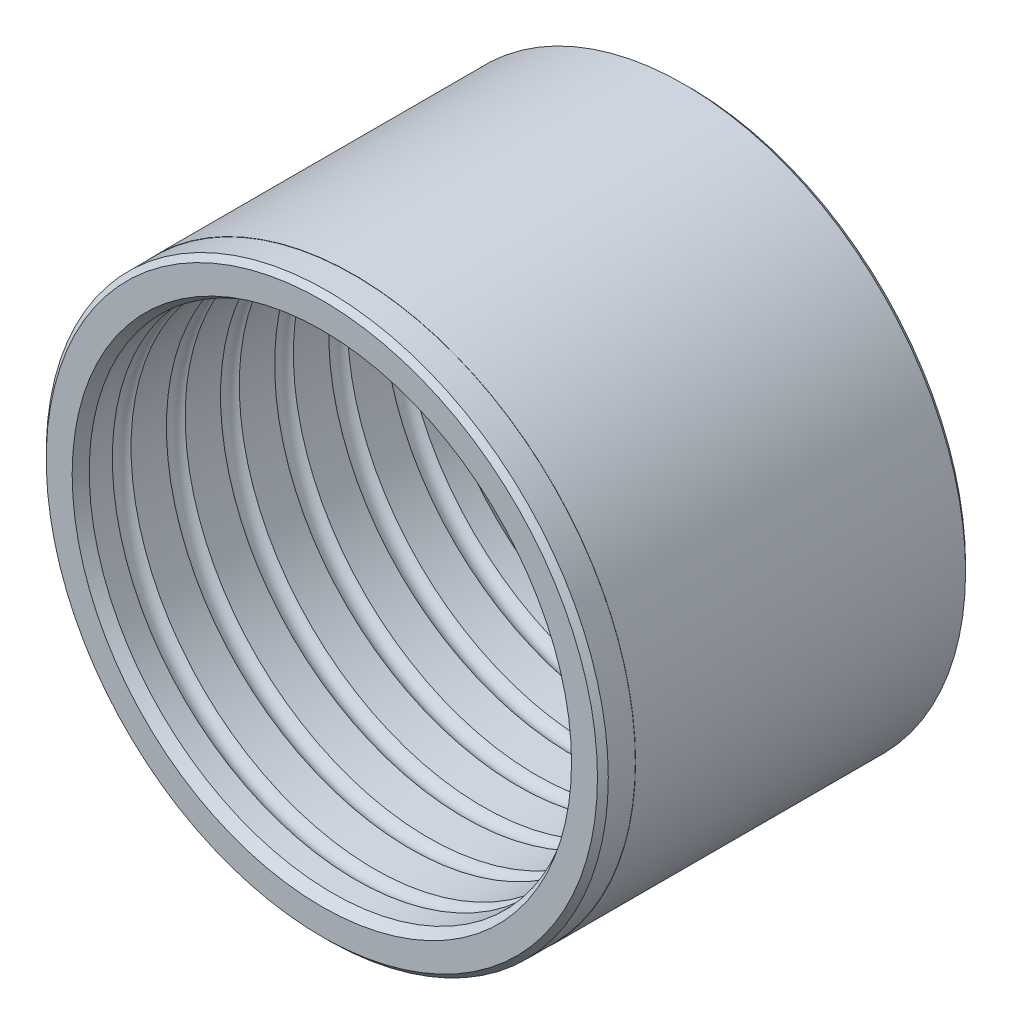
ISO-10303-21;
HEADER;
FILE_DESCRIPTION(('STEP AP214'),'2;1');
FILE_NAME('part.step','',(''),(''),'','','');
FILE_SCHEMA(('AUTOMOTIVE_DESIGN { 1 0 10303 214 1 1 1 1 }'));
ENDSEC;
DATA;
#1=APPLICATION_CONTEXT('core data for automotive mechanical design processes');
#2=APPLICATION_PROTOCOL_DEFINITION('international standard','automotive_design',2000,#1);
#3=PRODUCT_CONTEXT('',#1,'mechanical');
#4=PRODUCT('Part','Part','',(#3));
#5=PRODUCT_RELATED_PRODUCT_CATEGORY('part','',(#4));
#6=PRODUCT_DEFINITION_FORMATION('','',#4);
#7=PRODUCT_DEFINITION_CONTEXT('part definition',#1,'design');
#8=PRODUCT_DEFINITION('design','',#6,#7);
#9=PRODUCT_DEFINITION_SHAPE('','',#8);
#10=(LENGTH_UNIT() NAMED_UNIT(*) SI_UNIT(.MILLI.,.METRE.));
#11=(NAMED_UNIT(*) PLANE_ANGLE_UNIT() SI_UNIT($,.RADIAN.));
#12=(NAMED_UNIT(*) SI_UNIT($,.STERADIAN.) SOLID_ANGLE_UNIT());
#13=UNCERTAINTY_MEASURE_WITH_UNIT(LENGTH_MEASURE(1.E-05),#10,'distance_accuracy_value','');
#14=(GEOMETRIC_REPRESENTATION_CONTEXT(3) GLOBAL_UNCERTAINTY_ASSIGNED_CONTEXT((#13)) GLOBAL_UNIT_ASSIGNED_CONTEXT((#10,
#11,#12)) REPRESENTATION_CONTEXT('',''));
#15=CARTESIAN_POINT('',(0.,0.,0.));
#16=DIRECTION('',(0.,0.,1.));
#17=DIRECTION('',(1.,0.,0.));
#18=AXIS2_PLACEMENT_3D('',#15,#16,#17);
#19=CARTESIAN_POINT('',(0.,26.,-3.));
#20=DIRECTION('',(0.,0.,-1.));
#21=DIRECTION('',(-1.,0.,0.));
#22=AXIS2_PLACEMENT_3D('',#19,#20,#21);
#23=PLANE('',#22);
#24=CARTESIAN_POINT('',(0.,0.,-3.));
#25=DIRECTION('',(0.,0.,1.));
#26=DIRECTION('',(1.,0.,0.));
#27=AXIS2_PLACEMENT_3D('',#24,#25,#26);
#28=CIRCLE('',#27,25.975);
#29=CARTESIAN_POINT('',(25.975,0.,-3.));
#30=VERTEX_POINT('',#29);
#31=EDGE_CURVE('E10',#30,#30,#28,.T.);
#32=ORIENTED_EDGE('',*,*,#31,.F.);
#33=EDGE_LOOP('',(#32));
#34=FACE_BOUND('',#33,.T.);
#35=CARTESIAN_POINT('',(0.,0.,-3.));
#36=DIRECTION('',(0.,0.,1.));
#37=DIRECTION('',(1.,0.,0.));
#38=AXIS2_PLACEMENT_3D('',#35,#36,#37);
#39=CIRCLE('',#38,26.);
#40=CARTESIAN_POINT('',(26.,0.,-3.));
#41=VERTEX_POINT('',#40);
#42=EDGE_CURVE('E134',#41,#41,#39,.T.);
#43=ORIENTED_EDGE('',*,*,#42,.T.);
#44=EDGE_LOOP('',(#43));
#45=FACE_BOUND('',#44,.T.);
#46=ADVANCED_FACE('F41',(#34,#45),#23,.F.);
#47=CARTESIAN_POINT('',(0.,0.,0.));
#48=DIRECTION('',(0.,0.,1.));
#49=DIRECTION('',(1.,0.,0.));
#50=AXIS2_PLACEMENT_3D('',#47,#48,#49);
#51=CYLINDRICAL_SURFACE('',#50,25.975);
#52=CARTESIAN_POINT('',(0.,0.,-0.5));
#53=DIRECTION('',(0.,0.,1.));
#54=DIRECTION('',(1.,0.,0.));
#55=AXIS2_PLACEMENT_3D('',#52,#53,#54);
#56=CIRCLE('',#55,25.975);
#57=CARTESIAN_POINT('',(25.975,0.,-0.5));
#58=VERTEX_POINT('',#57);
#59=EDGE_CURVE('E48',#58,#58,#56,.T.);
#60=ORIENTED_EDGE('',*,*,#59,.F.);
#61=EDGE_LOOP('',(#60));
#62=FACE_BOUND('',#61,.T.);
#63=ORIENTED_EDGE('',*,*,#31,.T.);
#64=EDGE_LOOP('',(#63));
#65=FACE_BOUND('',#64,.T.);
#66=ADVANCED_FACE('F257',(#62,#65),#51,.T.);
#67=CARTESIAN_POINT('',(0.,0.,-0.5));
#68=DIRECTION('',(0.,0.,-1.));
#69=DIRECTION('',(-1.,0.,0.));
#70=AXIS2_PLACEMENT_3D('',#67,#68,#69);
#71=CONICAL_SURFACE('',#70,25.975,0.785398163397445);
#72=CARTESIAN_POINT('',(0.,0.,0.));
#73=DIRECTION('',(0.,0.,1.));
#74=DIRECTION('',(1.,0.,0.));
#75=AXIS2_PLACEMENT_3D('',#72,#73,#74);
#76=CIRCLE('',#75,25.475);
#77=CARTESIAN_POINT('',(25.475,0.,0.));
#78=VERTEX_POINT('',#77);
#79=EDGE_CURVE('E54',#78,#78,#76,.T.);
#80=ORIENTED_EDGE('',*,*,#79,.F.);
#81=EDGE_LOOP('',(#80));
#82=FACE_BOUND('',#81,.T.);
#83=ORIENTED_EDGE('',*,*,#59,.T.);
#84=EDGE_LOOP('',(#83));
#85=FACE_BOUND('',#84,.T.);
#86=ADVANCED_FACE('F252',(#82,#85),#71,.T.);
#87=CARTESIAN_POINT('',(0.,25.475,0.));
#88=DIRECTION('',(0.,0.,-1.));
#89=DIRECTION('',(-1.,0.,0.));
#90=AXIS2_PLACEMENT_3D('',#87,#88,#89);
#91=PLANE('',#90);
#92=CARTESIAN_POINT('',(0.,0.,0.));
#93=DIRECTION('',(0.,0.,1.));
#94=DIRECTION('',(1.,0.,0.));
#95=AXIS2_PLACEMENT_3D('',#92,#93,#94);
#96=CIRCLE('',#95,23.0773502691895);
#97=CARTESIAN_POINT('',(23.0773502691895,0.,0.));
#98=VERTEX_POINT('',#97);
#99=EDGE_CURVE('E60',#98,#98,#96,.T.);
#100=ORIENTED_EDGE('',*,*,#99,.F.);
#101=EDGE_LOOP('',(#100));
#102=FACE_BOUND('',#101,.T.);
#103=ORIENTED_EDGE('',*,*,#79,.T.);
#104=EDGE_LOOP('',(#103));
#105=FACE_BOUND('',#104,.T.);
#106=ADVANCED_FACE('F246',(#102,#105),#91,.F.);
#107=CARTESIAN_POINT('',(0.,0.,0.));
#108=DIRECTION('',(0.,0.,1.));
#109=DIRECTION('',(1.,0.,0.));
#110=AXIS2_PLACEMENT_3D('',#107,#108,#109);
#111=CONICAL_SURFACE('',#110,23.0773502691895,0.523598775598179);
#112=CARTESIAN_POINT('',(0.,0.,-1.));
#113=DIRECTION('',(0.,0.,1.));
#114=DIRECTION('',(1.,0.,0.));
#115=AXIS2_PLACEMENT_3D('',#112,#113,#114);
#116=CIRCLE('',#115,22.5);
#117=CARTESIAN_POINT('',(22.5,0.,-1.));
#118=VERTEX_POINT('',#117);
#119=EDGE_CURVE('E66',#118,#118,#116,.T.);
#120=ORIENTED_EDGE('',*,*,#119,.F.);
#121=EDGE_LOOP('',(#120));
#122=FACE_BOUND('',#121,.T.);
#123=ORIENTED_EDGE('',*,*,#99,.T.);
#124=EDGE_LOOP('',(#123));
#125=FACE_BOUND('',#124,.T.);
#126=ADVANCED_FACE('F240',(#122,#125),#111,.F.);
#127=CARTESIAN_POINT('',(0.,0.,0.));
#128=DIRECTION('',(0.,0.,1.));
#129=DIRECTION('',(1.,0.,0.));
#130=AXIS2_PLACEMENT_3D('',#127,#128,#129);
#131=CYLINDRICAL_SURFACE('',#130,22.5);
#132=CARTESIAN_POINT('',(0.,0.,-3.13397459621556));
#133=DIRECTION('',(0.,0.,1.));
#134=DIRECTION('',(1.,0.,0.));
#135=AXIS2_PLACEMENT_3D('',#132,#133,#134);
#136=CIRCLE('',#135,22.5);
#137=CARTESIAN_POINT('',(22.5,0.,-3.13397459621556));
#138=VERTEX_POINT('',#137);
#139=EDGE_CURVE('E70',#138,#138,#136,.T.);
#140=ORIENTED_EDGE('',*,*,#139,.F.);
#141=EDGE_LOOP('',(#140));
#142=FACE_BOUND('',#141,.T.);
#143=ORIENTED_EDGE('',*,*,#119,.T.);
#144=EDGE_LOOP('',(#143));
#145=FACE_BOUND('',#144,.T.);
#146=ADVANCED_FACE('F234',(#142,#145),#131,.F.);
#147=CARTESIAN_POINT('',(0.,0.,-4.));
#148=DIRECTION('',(0.,0.,1.));
#149=DIRECTION('',(1.,0.,0.));
#150=AXIS2_PLACEMENT_3D('',#147,#148,#149);
#151=TOROIDAL_SURFACE('',#150,22.,1.);
#152=CARTESIAN_POINT('',(0.,0.,-4.86602540378444));
#153=DIRECTION('',(0.,0.,1.));
#154=DIRECTION('',(1.,0.,0.));
#155=AXIS2_PLACEMENT_3D('',#152,#153,#154);
#156=CIRCLE('',#155,22.5);
#157=CARTESIAN_POINT('',(22.5,0.,-4.86602540378444));
#158=VERTEX_POINT('',#157);
#159=EDGE_CURVE('E74',#158,#158,#156,.T.);
#160=ORIENTED_EDGE('',*,*,#159,.F.);
#161=EDGE_LOOP('',(#160));
#162=FACE_BOUND('',#161,.T.);
#163=ORIENTED_EDGE('',*,*,#139,.T.);
#164=EDGE_LOOP('',(#163));
#165=FACE_BOUND('',#164,.T.);
#166=ADVANCED_FACE('F228',(#162,#165),#151,.F.);
#167=CARTESIAN_POINT('',(0.,0.,0.));
#168=DIRECTION('',(0.,0.,1.));
#169=DIRECTION('',(1.,0.,0.));
#170=AXIS2_PLACEMENT_3D('',#167,#168,#169);
#171=CYLINDRICAL_SURFACE('',#170,22.5);
#172=CARTESIAN_POINT('',(0.,0.,-8.13397459621556));
#173=DIRECTION('',(0.,0.,1.));
#174=DIRECTION('',(1.,0.,0.));
#175=AXIS2_PLACEMENT_3D('',#172,#173,#174);
#176=CIRCLE('',#175,22.5);
#177=CARTESIAN_POINT('',(22.5,0.,-8.13397459621556));
#178=VERTEX_POINT('',#177);
#179=EDGE_CURVE('E78',#178,#178,#176,.T.);
#180=ORIENTED_EDGE('',*,*,#179,.F.);
#181=EDGE_LOOP('',(#180));
#182=FACE_BOUND('',#181,.T.);
#183=ORIENTED_EDGE('',*,*,#159,.T.);
#184=EDGE_LOOP('',(#183));
#185=FACE_BOUND('',#184,.T.);
#186=ADVANCED_FACE('F222',(#182,#185),#171,.F.);
#187=CARTESIAN_POINT('',(0.,0.,-9.));
#188=DIRECTION('',(0.,0.,1.));
#189=DIRECTION('',(1.,0.,0.));
#190=AXIS2_PLACEMENT_3D('',#187,#188,#189);
#191=TOROIDAL_SURFACE('',#190,22.,1.);
#192=CARTESIAN_POINT('',(0.,0.,-9.86602540378444));
#193=DIRECTION('',(0.,0.,1.));
#194=DIRECTION('',(1.,0.,0.));
#195=AXIS2_PLACEMENT_3D('',#192,#193,#194);
#196=CIRCLE('',#195,22.5);
#197=CARTESIAN_POINT('',(22.5,0.,-9.86602540378444));
#198=VERTEX_POINT('',#197);
#199=EDGE_CURVE('E82',#198,#198,#196,.T.);
#200=ORIENTED_EDGE('',*,*,#199,.F.);
#201=EDGE_LOOP('',(#200));
#202=FACE_BOUND('',#201,.T.);
#203=ORIENTED_EDGE('',*,*,#179,.T.);
#204=EDGE_LOOP('',(#203));
#205=FACE_BOUND('',#204,.T.);
#206=ADVANCED_FACE('F216',(#202,#205),#191,.F.);
#207=CARTESIAN_POINT('',(0.,0.,0.));
#208=DIRECTION('',(0.,0.,1.));
#209=DIRECTION('',(1.,0.,0.));
#210=AXIS2_PLACEMENT_3D('',#207,#208,#209);
#211=CYLINDRICAL_SURFACE('',#210,22.5);
#212=CARTESIAN_POINT('',(0.,0.,-13.1339745962156));
#213=DIRECTION('',(0.,0.,1.));
#214=DIRECTION('',(1.,0.,0.));
#215=AXIS2_PLACEMENT_3D('',#212,#213,#214);
#216=CIRCLE('',#215,22.5);
#217=CARTESIAN_POINT('',(22.5,0.,-13.1339745962156));
#218=VERTEX_POINT('',#217);
#219=EDGE_CURVE('E86',#218,#218,#216,.T.);
#220=ORIENTED_EDGE('',*,*,#219,.F.);
#221=EDGE_LOOP('',(#220));
#222=FACE_BOUND('',#221,.T.);
#223=ORIENTED_EDGE('',*,*,#199,.T.);
#224=EDGE_LOOP('',(#223));
#225=FACE_BOUND('',#224,.T.);
#226=ADVANCED_FACE('F210',(#222,#225),#211,.F.);
#227=CARTESIAN_POINT('',(0.,0.,-14.));
#228=DIRECTION('',(0.,0.,1.));
#229=DIRECTION('',(1.,0.,0.));
#230=AXIS2_PLACEMENT_3D('',#227,#228,#229);
#231=TOROIDAL_SURFACE('',#230,22.,0.999999999999999);
#232=CARTESIAN_POINT('',(0.,0.,-14.8660254037844));
#233=DIRECTION('',(0.,0.,1.));
#234=DIRECTION('',(1.,0.,0.));
#235=AXIS2_PLACEMENT_3D('',#232,#233,#234);
#236=CIRCLE('',#235,22.5);
#237=CARTESIAN_POINT('',(22.5,0.,-14.8660254037844));
#238=VERTEX_POINT('',#237);
#239=EDGE_CURVE('E90',#238,#238,#236,.T.);
#240=ORIENTED_EDGE('',*,*,#239,.F.);
#241=EDGE_LOOP('',(#240));
#242=FACE_BOUND('',#241,.T.);
#243=ORIENTED_EDGE('',*,*,#219,.T.);
#244=EDGE_LOOP('',(#243));
#245=FACE_BOUND('',#244,.T.);
#246=ADVANCED_FACE('F204',(#242,#245),#231,.F.);
#247=CARTESIAN_POINT('',(0.,0.,0.));
#248=DIRECTION('',(0.,0.,1.));
#249=DIRECTION('',(1.,0.,0.));
#250=AXIS2_PLACEMENT_3D('',#247,#248,#249);
#251=CYLINDRICAL_SURFACE('',#250,22.5);
#252=CARTESIAN_POINT('',(0.,0.,-18.1339745962156));
#253=DIRECTION('',(0.,0.,1.));
#254=DIRECTION('',(1.,0.,0.));
#255=AXIS2_PLACEMENT_3D('',#252,#253,#254);
#256=CIRCLE('',#255,22.5);
#257=CARTESIAN_POINT('',(22.5,0.,-18.1339745962156));
#258=VERTEX_POINT('',#257);
#259=EDGE_CURVE('E94',#258,#258,#256,.T.);
#260=ORIENTED_EDGE('',*,*,#259,.F.);
#261=EDGE_LOOP('',(#260));
#262=FACE_BOUND('',#261,.T.);
#263=ORIENTED_EDGE('',*,*,#239,.T.);
#264=EDGE_LOOP('',(#263));
#265=FACE_BOUND('',#264,.T.);
#266=ADVANCED_FACE('F198',(#262,#265),#251,.F.);
#267=CARTESIAN_POINT('',(0.,0.,-19.));
#268=DIRECTION('',(0.,0.,1.));
#269=DIRECTION('',(1.,0.,0.));
#270=AXIS2_PLACEMENT_3D('',#267,#268,#269);
#271=TOROIDAL_SURFACE('',#270,22.,1.);
#272=CARTESIAN_POINT('',(0.,0.,-19.8660254037844));
#273=DIRECTION('',(0.,0.,1.));
#274=DIRECTION('',(1.,0.,0.));
#275=AXIS2_PLACEMENT_3D('',#272,#273,#274);
#276=CIRCLE('',#275,22.5);
#277=CARTESIAN_POINT('',(22.5,0.,-19.8660254037844));
#278=VERTEX_POINT('',#277);
#279=EDGE_CURVE('E98',#278,#278,#276,.T.);
#280=ORIENTED_EDGE('',*,*,#279,.F.);
#281=EDGE_LOOP('',(#280));
#282=FACE_BOUND('',#281,.T.);
#283=ORIENTED_EDGE('',*,*,#259,.T.);
#284=EDGE_LOOP('',(#283));
#285=FACE_BOUND('',#284,.T.);
#286=ADVANCED_FACE('F192',(#282,#285),#271,.F.);
#287=CARTESIAN_POINT('',(0.,0.,0.));
#288=DIRECTION('',(0.,0.,1.));
#289=DIRECTION('',(1.,0.,0.));
#290=AXIS2_PLACEMENT_3D('',#287,#288,#289);
#291=CYLINDRICAL_SURFACE('',#290,22.5);
#292=CARTESIAN_POINT('',(0.,0.,-23.1339745962156));
#293=DIRECTION('',(0.,0.,1.));
#294=DIRECTION('',(1.,0.,0.));
#295=AXIS2_PLACEMENT_3D('',#292,#293,#294);
#296=CIRCLE('',#295,22.5);
#297=CARTESIAN_POINT('',(22.5,0.,-23.1339745962156));
#298=VERTEX_POINT('',#297);
#299=EDGE_CURVE('E102',#298,#298,#296,.T.);
#300=ORIENTED_EDGE('',*,*,#299,.F.);
#301=EDGE_LOOP('',(#300));
#302=FACE_BOUND('',#301,.T.);
#303=ORIENTED_EDGE('',*,*,#279,.T.);
#304=EDGE_LOOP('',(#303));
#305=FACE_BOUND('',#304,.T.);
#306=ADVANCED_FACE('F186',(#302,#305),#291,.F.);
#307=CARTESIAN_POINT('',(0.,0.,-24.));
#308=DIRECTION('',(0.,0.,1.));
#309=DIRECTION('',(1.,0.,0.));
#310=AXIS2_PLACEMENT_3D('',#307,#308,#309);
#311=TOROIDAL_SURFACE('',#310,22.,1.);
#312=CARTESIAN_POINT('',(0.,0.,-24.8660254037844));
#313=DIRECTION('',(0.,0.,1.));
#314=DIRECTION('',(1.,0.,0.));
#315=AXIS2_PLACEMENT_3D('',#312,#313,#314);
#316=CIRCLE('',#315,22.5);
#317=CARTESIAN_POINT('',(22.5,0.,-24.8660254037844));
#318=VERTEX_POINT('',#317);
#319=EDGE_CURVE('E106',#318,#318,#316,.T.);
#320=ORIENTED_EDGE('',*,*,#319,.F.);
#321=EDGE_LOOP('',(#320));
#322=FACE_BOUND('',#321,.T.);
#323=ORIENTED_EDGE('',*,*,#299,.T.);
#324=EDGE_LOOP('',(#323));
#325=FACE_BOUND('',#324,.T.);
#326=ADVANCED_FACE('F180',(#322,#325),#311,.F.);
#327=CARTESIAN_POINT('',(0.,0.,0.));
#328=DIRECTION('',(0.,0.,1.));
#329=DIRECTION('',(1.,0.,0.));
#330=AXIS2_PLACEMENT_3D('',#327,#328,#329);
#331=CYLINDRICAL_SURFACE('',#330,22.5);
#332=CARTESIAN_POINT('',(0.,0.,-28.1339745962156));
#333=DIRECTION('',(0.,0.,1.));
#334=DIRECTION('',(1.,0.,0.));
#335=AXIS2_PLACEMENT_3D('',#332,#333,#334);
#336=CIRCLE('',#335,22.5);
#337=CARTESIAN_POINT('',(22.5,0.,-28.1339745962156));
#338=VERTEX_POINT('',#337);
#339=EDGE_CURVE('E110',#338,#338,#336,.T.);
#340=ORIENTED_EDGE('',*,*,#339,.F.);
#341=EDGE_LOOP('',(#340));
#342=FACE_BOUND('',#341,.T.);
#343=ORIENTED_EDGE('',*,*,#319,.T.);
#344=EDGE_LOOP('',(#343));
#345=FACE_BOUND('',#344,.T.);
#346=ADVANCED_FACE('F174',(#342,#345),#331,.F.);
#347=CARTESIAN_POINT('',(0.,0.,-29.));
#348=DIRECTION('',(0.,0.,1.));
#349=DIRECTION('',(1.,0.,0.));
#350=AXIS2_PLACEMENT_3D('',#347,#348,#349);
#351=TOROIDAL_SURFACE('',#350,22.,1.);
#352=CARTESIAN_POINT('',(0.,0.,-29.8660254037844));
#353=DIRECTION('',(0.,0.,1.));
#354=DIRECTION('',(1.,0.,0.));
#355=AXIS2_PLACEMENT_3D('',#352,#353,#354);
#356=CIRCLE('',#355,22.5);
#357=CARTESIAN_POINT('',(22.5,0.,-29.8660254037844));
#358=VERTEX_POINT('',#357);
#359=EDGE_CURVE('E114',#358,#358,#356,.T.);
#360=ORIENTED_EDGE('',*,*,#359,.F.);
#361=EDGE_LOOP('',(#360));
#362=FACE_BOUND('',#361,.T.);
#363=ORIENTED_EDGE('',*,*,#339,.T.);
#364=EDGE_LOOP('',(#363));
#365=FACE_BOUND('',#364,.T.);
#366=ADVANCED_FACE('F168',(#362,#365),#351,.F.);
#367=CARTESIAN_POINT('',(0.,0.,0.));
#368=DIRECTION('',(0.,0.,1.));
#369=DIRECTION('',(1.,0.,0.));
#370=AXIS2_PLACEMENT_3D('',#367,#368,#369);
#371=CYLINDRICAL_SURFACE('',#370,22.5);
#372=CARTESIAN_POINT('',(0.,0.,-32.));
#373=DIRECTION('',(0.,0.,1.));
#374=DIRECTION('',(1.,0.,0.));
#375=AXIS2_PLACEMENT_3D('',#372,#373,#374);
#376=CIRCLE('',#375,22.5);
#377=CARTESIAN_POINT('',(22.5,0.,-32.));
#378=VERTEX_POINT('',#377);
#379=EDGE_CURVE('E118',#378,#378,#376,.T.);
#380=ORIENTED_EDGE('',*,*,#379,.F.);
#381=EDGE_LOOP('',(#380));
#382=FACE_BOUND('',#381,.T.);
#383=ORIENTED_EDGE('',*,*,#359,.T.);
#384=EDGE_LOOP('',(#383));
#385=FACE_BOUND('',#384,.T.);
#386=ADVANCED_FACE('F162',(#382,#385),#371,.F.);
#387=CARTESIAN_POINT('',(0.,0.,-32.));
#388=DIRECTION('',(0.,0.,-1.));
#389=DIRECTION('',(-1.,0.,0.));
#390=AXIS2_PLACEMENT_3D('',#387,#388,#389);
#391=CONICAL_SURFACE('',#390,22.5,0.785398163398466);
#392=CARTESIAN_POINT('',(0.,0.,-34.));
#393=DIRECTION('',(0.,0.,1.));
#394=DIRECTION('',(1.,0.,0.));
#395=AXIS2_PLACEMENT_3D('',#392,#393,#394);
#396=CIRCLE('',#395,24.5000000000041);
#397=CARTESIAN_POINT('',(24.5000000000041,0.,-34.));
#398=VERTEX_POINT('',#397);
#399=EDGE_CURVE('E122',#398,#398,#396,.T.);
#400=ORIENTED_EDGE('',*,*,#399,.F.);
#401=EDGE_LOOP('',(#400));
#402=FACE_BOUND('',#401,.T.);
#403=ORIENTED_EDGE('',*,*,#379,.T.);
#404=EDGE_LOOP('',(#403));
#405=FACE_BOUND('',#404,.T.);
#406=ADVANCED_FACE('F156',(#402,#405),#391,.F.);
#407=CARTESIAN_POINT('',(0.,24.5000000000041,-34.));
#408=DIRECTION('',(0.,0.,1.));
#409=DIRECTION('',(1.,0.,0.));
#410=AXIS2_PLACEMENT_3D('',#407,#408,#409);
#411=PLANE('',#410);
#412=CARTESIAN_POINT('',(0.,0.,-34.));
#413=DIRECTION('',(0.,0.,1.));
#414=DIRECTION('',(1.,0.,0.));
#415=AXIS2_PLACEMENT_3D('',#412,#413,#414);
#416=CIRCLE('',#415,25.5);
#417=CARTESIAN_POINT('',(25.5,0.,-34.));
#418=VERTEX_POINT('',#417);
#419=EDGE_CURVE('E126',#418,#418,#416,.T.);
#420=ORIENTED_EDGE('',*,*,#419,.F.);
#421=EDGE_LOOP('',(#420));
#422=FACE_BOUND('',#421,.T.);
#423=ORIENTED_EDGE('',*,*,#399,.T.);
#424=EDGE_LOOP('',(#423));
#425=FACE_BOUND('',#424,.T.);
#426=ADVANCED_FACE('F150',(#422,#425),#411,.F.);
#427=CARTESIAN_POINT('',(0.,0.,-34.));
#428=DIRECTION('',(0.,0.,1.));
#429=DIRECTION('',(1.,0.,0.));
#430=AXIS2_PLACEMENT_3D('',#427,#428,#429);
#431=CONICAL_SURFACE('',#430,25.5,0.785398163397445);
#432=CARTESIAN_POINT('',(0.,0.,-33.5));
#433=DIRECTION('',(0.,0.,1.));
#434=DIRECTION('',(1.,0.,0.));
#435=AXIS2_PLACEMENT_3D('',#432,#433,#434);
#436=CIRCLE('',#435,26.);
#437=CARTESIAN_POINT('',(26.,0.,-33.5));
#438=VERTEX_POINT('',#437);
#439=EDGE_CURVE('E130',#438,#438,#436,.T.);
#440=ORIENTED_EDGE('',*,*,#439,.F.);
#441=EDGE_LOOP('',(#440));
#442=FACE_BOUND('',#441,.T.);
#443=ORIENTED_EDGE('',*,*,#419,.T.);
#444=EDGE_LOOP('',(#443));
#445=FACE_BOUND('',#444,.T.);
#446=ADVANCED_FACE('F144',(#442,#445),#431,.T.);
#447=CARTESIAN_POINT('',(0.,0.,0.));
#448=DIRECTION('',(0.,0.,1.));
#449=DIRECTION('',(1.,0.,0.));
#450=AXIS2_PLACEMENT_3D('',#447,#448,#449);
#451=CYLINDRICAL_SURFACE('',#450,26.);
#452=ORIENTED_EDGE('',*,*,#42,.F.);
#453=EDGE_LOOP('',(#452));
#454=FACE_BOUND('',#453,.T.);
#455=ORIENTED_EDGE('',*,*,#439,.T.);
#456=EDGE_LOOP('',(#455));
#457=FACE_BOUND('',#456,.T.);
#458=ADVANCED_FACE('F141',(#454,#457),#451,.T.);
#459=CLOSED_SHELL('',(#46,#66,#86,#106,#126,#146,#166,#186,#206,#226,#246,#266,#286,#306,#326,
#346,#366,#386,#406,#426,#446,#458));
#460=MANIFOLD_SOLID_BREP('B2',#459);
#461=ADVANCED_BREP_SHAPE_REPRESENTATION('',(#18,#460),#14);
#462=SHAPE_DEFINITION_REPRESENTATION(#9,#461);
ENDSEC;
END-ISO-10303-21;
